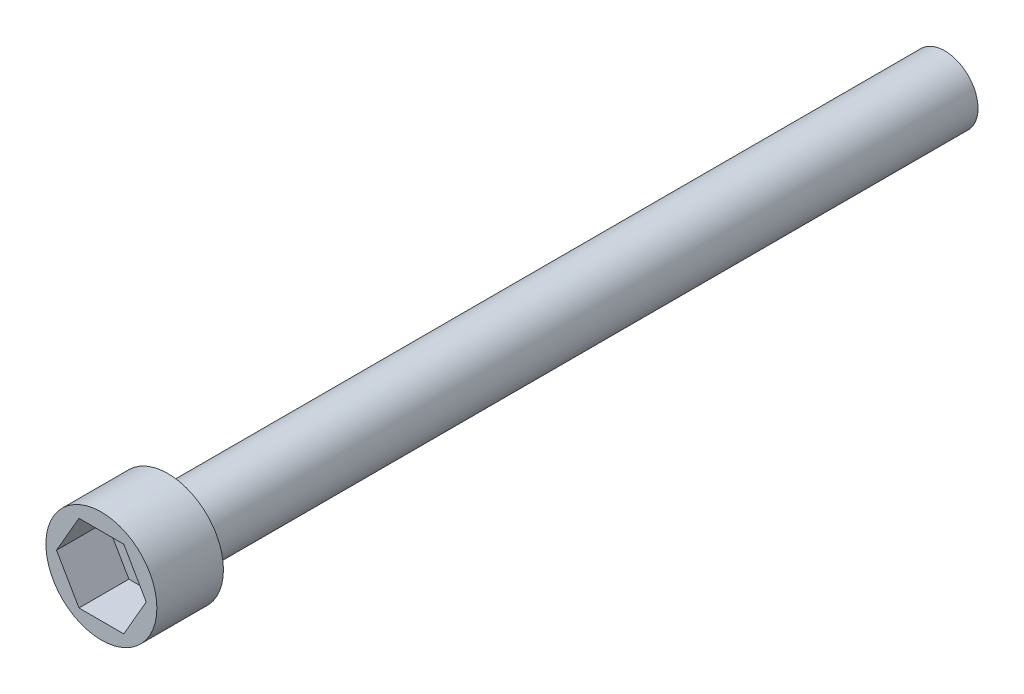
ISO-10303-21;
HEADER;
FILE_DESCRIPTION(('STEP AP214'),'2;1');
FILE_NAME('part.step','',(''),(''),'','','');
FILE_SCHEMA(('AUTOMOTIVE_DESIGN { 1 0 10303 214 1 1 1 1 }'));
ENDSEC;
DATA;
#1=APPLICATION_CONTEXT('core data for automotive mechanical design processes');
#2=APPLICATION_PROTOCOL_DEFINITION('international standard','automotive_design',2000,#1);
#3=PRODUCT_CONTEXT('',#1,'mechanical');
#4=PRODUCT('Part','Part','',(#3));
#5=PRODUCT_RELATED_PRODUCT_CATEGORY('part','',(#4));
#6=PRODUCT_DEFINITION_FORMATION('','',#4);
#7=PRODUCT_DEFINITION_CONTEXT('part definition',#1,'design');
#8=PRODUCT_DEFINITION('design','',#6,#7);
#9=PRODUCT_DEFINITION_SHAPE('','',#8);
#10=(LENGTH_UNIT() NAMED_UNIT(*) SI_UNIT(.MILLI.,.METRE.));
#11=(NAMED_UNIT(*) PLANE_ANGLE_UNIT() SI_UNIT($,.RADIAN.));
#12=(NAMED_UNIT(*) SI_UNIT($,.STERADIAN.) SOLID_ANGLE_UNIT());
#13=UNCERTAINTY_MEASURE_WITH_UNIT(LENGTH_MEASURE(1.E-05),#10,'distance_accuracy_value','');
#14=(GEOMETRIC_REPRESENTATION_CONTEXT(3) GLOBAL_UNCERTAINTY_ASSIGNED_CONTEXT((#13)) GLOBAL_UNIT_ASSIGNED_CONTEXT((#10,
#11,#12)) REPRESENTATION_CONTEXT('',''));
#15=CARTESIAN_POINT('',(0.,0.,0.));
#16=DIRECTION('',(0.,0.,1.));
#17=DIRECTION('',(1.,0.,0.));
#18=AXIS2_PLACEMENT_3D('',#15,#16,#17);
#19=CARTESIAN_POINT('',(0.,0.,70.));
#20=DIRECTION('',(0.,0.,-1.));
#21=DIRECTION('',(-1.,0.,0.));
#22=AXIS2_PLACEMENT_3D('',#19,#20,#21);
#23=CYLINDRICAL_SURFACE('',#22,3.);
#24=CARTESIAN_POINT('',(0.,0.,70.));
#25=DIRECTION('',(0.,0.,1.));
#26=DIRECTION('',(1.,0.,0.));
#27=AXIS2_PLACEMENT_3D('',#24,#25,#26);
#28=CIRCLE('',#27,3.);
#29=CARTESIAN_POINT('',(3.,0.,70.));
#30=VERTEX_POINT('',#29);
#31=EDGE_CURVE('E11',#30,#30,#28,.T.);
#32=ORIENTED_EDGE('',*,*,#31,.F.);
#33=EDGE_LOOP('',(#32));
#34=FACE_BOUND('',#33,.T.);
#35=CARTESIAN_POINT('',(0.,0.,0.));
#36=DIRECTION('',(0.,0.,1.));
#37=DIRECTION('',(1.,0.,0.));
#38=AXIS2_PLACEMENT_3D('',#35,#36,#37);
#39=CIRCLE('',#38,3.);
#40=CARTESIAN_POINT('',(3.,0.,0.));
#41=VERTEX_POINT('',#40);
#42=EDGE_CURVE('E44',#41,#41,#39,.T.);
#43=ORIENTED_EDGE('',*,*,#42,.T.);
#44=EDGE_LOOP('',(#43));
#45=FACE_BOUND('',#44,.T.);
#46=ADVANCED_FACE('F41',(#34,#45),#23,.T.);
#47=CARTESIAN_POINT('',(0.,0.,0.));
#48=DIRECTION('',(0.,0.,1.));
#49=DIRECTION('',(1.,0.,0.));
#50=AXIS2_PLACEMENT_3D('',#47,#48,#49);
#51=PLANE('',#50);
#52=ORIENTED_EDGE('',*,*,#42,.F.);
#53=EDGE_LOOP('',(#52));
#54=FACE_BOUND('',#53,.T.);
#55=ADVANCED_FACE('F191',(#54),#51,.F.);
#56=CARTESIAN_POINT('',(0.,0.,76.));
#57=DIRECTION('',(0.,0.,-1.));
#58=DIRECTION('',(-1.,0.,0.));
#59=AXIS2_PLACEMENT_3D('',#56,#57,#58);
#60=CYLINDRICAL_SURFACE('',#59,5.);
#61=CARTESIAN_POINT('',(0.,0.,76.));
#62=DIRECTION('',(0.,0.,1.));
#63=DIRECTION('',(1.,0.,0.));
#64=AXIS2_PLACEMENT_3D('',#61,#62,#63);
#65=CIRCLE('',#64,5.);
#66=CARTESIAN_POINT('',(5.,0.,76.));
#67=VERTEX_POINT('',#66);
#68=EDGE_CURVE('E165',#67,#67,#65,.T.);
#69=ORIENTED_EDGE('',*,*,#68,.F.);
#70=EDGE_LOOP('',(#69));
#71=FACE_BOUND('',#70,.T.);
#72=CARTESIAN_POINT('',(0.,0.,70.));
#73=DIRECTION('',(0.,0.,1.));
#74=DIRECTION('',(1.,0.,0.));
#75=AXIS2_PLACEMENT_3D('',#72,#73,#74);
#76=CIRCLE('',#75,5.);
#77=CARTESIAN_POINT('',(5.,0.,70.));
#78=VERTEX_POINT('',#77);
#79=EDGE_CURVE('E155',#78,#78,#76,.T.);
#80=ORIENTED_EDGE('',*,*,#79,.T.);
#81=EDGE_LOOP('',(#80));
#82=FACE_BOUND('',#81,.T.);
#83=ADVANCED_FACE('F173',(#71,#82),#60,.T.);
#84=CARTESIAN_POINT('',(0.,0.,76.));
#85=DIRECTION('',(0.,0.,1.));
#86=DIRECTION('',(1.,0.,0.));
#87=AXIS2_PLACEMENT_3D('',#84,#85,#86);
#88=PLANE('',#87);
#89=DIRECTION('',(0.5,0.866025403784439,0.));
#90=VECTOR('',#89,1.);
#91=CARTESIAN_POINT('',(2.02072594216369,-3.5,76.));
#92=LINE('',#91,#90);
#93=CARTESIAN_POINT('',(2.02072594216369,-3.5,76.));
#94=VERTEX_POINT('',#93);
#95=CARTESIAN_POINT('',(4.04145188432738,0.,76.));
#96=VERTEX_POINT('',#95);
#97=EDGE_CURVE('E56',#94,#96,#92,.T.);
#98=ORIENTED_EDGE('',*,*,#97,.F.);
#99=DIRECTION('',(1.,0.,0.));
#100=VECTOR('',#99,1.);
#101=CARTESIAN_POINT('',(-2.02072594216369,-3.5,76.));
#102=LINE('',#101,#100);
#103=CARTESIAN_POINT('',(-2.02072594216369,-3.5,76.));
#104=VERTEX_POINT('',#103);
#105=EDGE_CURVE('E149',#104,#94,#102,.T.);
#106=ORIENTED_EDGE('',*,*,#105,.F.);
#107=DIRECTION('',(0.5,-0.866025403784439,0.));
#108=VECTOR('',#107,1.);
#109=CARTESIAN_POINT('',(-4.04145188432738,0.,76.));
#110=LINE('',#109,#108);
#111=CARTESIAN_POINT('',(-4.04145188432738,0.,76.));
#112=VERTEX_POINT('',#111);
#113=EDGE_CURVE('E146',#112,#104,#110,.T.);
#114=ORIENTED_EDGE('',*,*,#113,.F.);
#115=DIRECTION('',(-0.5,-0.866025403784439,0.));
#116=VECTOR('',#115,1.);
#117=CARTESIAN_POINT('',(-2.02072594216369,3.5,76.));
#118=LINE('',#117,#116);
#119=CARTESIAN_POINT('',(-2.02072594216369,3.5,76.));
#120=VERTEX_POINT('',#119);
#121=EDGE_CURVE('E104',#120,#112,#118,.T.);
#122=ORIENTED_EDGE('',*,*,#121,.F.);
#123=DIRECTION('',(-1.,0.,0.));
#124=VECTOR('',#123,1.);
#125=CARTESIAN_POINT('',(2.02072594216369,3.5,76.));
#126=LINE('',#125,#124);
#127=CARTESIAN_POINT('',(2.02072594216369,3.5,76.));
#128=VERTEX_POINT('',#127);
#129=EDGE_CURVE('E140',#128,#120,#126,.T.);
#130=ORIENTED_EDGE('',*,*,#129,.F.);
#131=DIRECTION('',(-0.5,0.866025403784439,0.));
#132=VECTOR('',#131,1.);
#133=CARTESIAN_POINT('',(4.04145188432738,0.,76.));
#134=LINE('',#133,#132);
#135=EDGE_CURVE('E136',#96,#128,#134,.T.);
#136=ORIENTED_EDGE('',*,*,#135,.F.);
#137=EDGE_LOOP('',(#98,#106,#114,#122,#130,#136));
#138=FACE_BOUND('',#137,.T.);
#139=ORIENTED_EDGE('',*,*,#68,.T.);
#140=EDGE_LOOP('',(#139));
#141=FACE_BOUND('',#140,.T.);
#142=ADVANCED_FACE('F178',(#138,#141),#88,.T.);
#143=CARTESIAN_POINT('',(0.,0.,70.));
#144=DIRECTION('',(0.,0.,1.));
#145=DIRECTION('',(1.,0.,0.));
#146=AXIS2_PLACEMENT_3D('',#143,#144,#145);
#147=PLANE('',#146);
#148=ORIENTED_EDGE('',*,*,#31,.T.);
#149=EDGE_LOOP('',(#148));
#150=FACE_BOUND('',#149,.T.);
#151=ORIENTED_EDGE('',*,*,#79,.F.);
#152=EDGE_LOOP('',(#151));
#153=FACE_BOUND('',#152,.T.);
#154=ADVANCED_FACE('F175',(#150,#153),#147,.F.);
#155=CARTESIAN_POINT('',(2.02072594216369,-3.5,71.5));
#156=DIRECTION('',(0.866025403784439,-0.5,0.));
#157=DIRECTION('',(0.5,0.866025403784439,0.));
#158=AXIS2_PLACEMENT_3D('',#155,#156,#157);
#159=PLANE('',#158);
#160=ORIENTED_EDGE('',*,*,#97,.T.);
#161=DIRECTION('',(0.,0.,1.));
#162=VECTOR('',#161,1.);
#163=CARTESIAN_POINT('',(4.04145188432738,0.,71.5));
#164=LINE('',#163,#162);
#165=CARTESIAN_POINT('',(4.04145188432738,0.,71.5));
#166=VERTEX_POINT('',#165);
#167=EDGE_CURVE('E86',#166,#96,#164,.T.);
#168=ORIENTED_EDGE('',*,*,#167,.F.);
#169=DIRECTION('',(0.5,0.866025403784439,0.));
#170=VECTOR('',#169,1.);
#171=CARTESIAN_POINT('',(2.02072594216369,-3.5,71.5));
#172=LINE('',#171,#170);
#173=CARTESIAN_POINT('',(2.02072594216369,-3.5,71.5));
#174=VERTEX_POINT('',#173);
#175=EDGE_CURVE('E152',#174,#166,#172,.T.);
#176=ORIENTED_EDGE('',*,*,#175,.F.);
#177=DIRECTION('',(0.,0.,1.));
#178=VECTOR('',#177,1.);
#179=CARTESIAN_POINT('',(2.02072594216369,-3.5,71.5));
#180=LINE('',#179,#178);
#181=EDGE_CURVE('E64',#174,#94,#180,.T.);
#182=ORIENTED_EDGE('',*,*,#181,.T.);
#183=EDGE_LOOP('',(#160,#168,#176,#182));
#184=FACE_BOUND('',#183,.T.);
#185=ADVANCED_FACE('F177',(#184),#159,.F.);
#186=CARTESIAN_POINT('',(-2.02072594216369,-3.5,71.5));
#187=DIRECTION('',(0.,-1.,0.));
#188=DIRECTION('',(1.,0.,0.));
#189=AXIS2_PLACEMENT_3D('',#186,#187,#188);
#190=PLANE('',#189);
#191=ORIENTED_EDGE('',*,*,#105,.T.);
#192=ORIENTED_EDGE('',*,*,#181,.F.);
#193=DIRECTION('',(1.,0.,0.));
#194=VECTOR('',#193,1.);
#195=CARTESIAN_POINT('',(-2.02072594216369,-3.5,71.5));
#196=LINE('',#195,#194);
#197=CARTESIAN_POINT('',(-2.02072594216369,-3.5,71.5));
#198=VERTEX_POINT('',#197);
#199=EDGE_CURVE('E118',#198,#174,#196,.T.);
#200=ORIENTED_EDGE('',*,*,#199,.F.);
#201=DIRECTION('',(0.,0.,1.));
#202=VECTOR('',#201,1.);
#203=CARTESIAN_POINT('',(-2.02072594216369,-3.5,71.5));
#204=LINE('',#203,#202);
#205=EDGE_CURVE('E109',#198,#104,#204,.T.);
#206=ORIENTED_EDGE('',*,*,#205,.T.);
#207=EDGE_LOOP('',(#191,#192,#200,#206));
#208=FACE_BOUND('',#207,.T.);
#209=ADVANCED_FACE('F185',(#208),#190,.F.);
#210=CARTESIAN_POINT('',(-4.04145188432738,0.,71.5));
#211=DIRECTION('',(-0.866025403784439,-0.5,0.));
#212=DIRECTION('',(0.5,-0.866025403784439,0.));
#213=AXIS2_PLACEMENT_3D('',#210,#211,#212);
#214=PLANE('',#213);
#215=ORIENTED_EDGE('',*,*,#113,.T.);
#216=ORIENTED_EDGE('',*,*,#205,.F.);
#217=DIRECTION('',(0.5,-0.866025403784439,0.));
#218=VECTOR('',#217,1.);
#219=CARTESIAN_POINT('',(-4.04145188432738,0.,71.5));
#220=LINE('',#219,#218);
#221=CARTESIAN_POINT('',(-4.04145188432738,0.,71.5));
#222=VERTEX_POINT('',#221);
#223=EDGE_CURVE('E113',#222,#198,#220,.T.);
#224=ORIENTED_EDGE('',*,*,#223,.F.);
#225=DIRECTION('',(0.,0.,1.));
#226=VECTOR('',#225,1.);
#227=CARTESIAN_POINT('',(-4.04145188432738,0.,71.5));
#228=LINE('',#227,#226);
#229=EDGE_CURVE('E97',#222,#112,#228,.T.);
#230=ORIENTED_EDGE('',*,*,#229,.T.);
#231=EDGE_LOOP('',(#215,#216,#224,#230));
#232=FACE_BOUND('',#231,.T.);
#233=ADVANCED_FACE('F114',(#232),#214,.F.);
#234=CARTESIAN_POINT('',(-2.02072594216369,3.5,71.5));
#235=DIRECTION('',(-0.866025403784439,0.5,0.));
#236=DIRECTION('',(-0.5,-0.866025403784439,0.));
#237=AXIS2_PLACEMENT_3D('',#234,#235,#236);
#238=PLANE('',#237);
#239=ORIENTED_EDGE('',*,*,#121,.T.);
#240=ORIENTED_EDGE('',*,*,#229,.F.);
#241=DIRECTION('',(-0.5,-0.866025403784439,0.));
#242=VECTOR('',#241,1.);
#243=CARTESIAN_POINT('',(-2.02072594216369,3.5,71.5));
#244=LINE('',#243,#242);
#245=CARTESIAN_POINT('',(-2.02072594216369,3.5,71.5));
#246=VERTEX_POINT('',#245);
#247=EDGE_CURVE('E101',#246,#222,#244,.T.);
#248=ORIENTED_EDGE('',*,*,#247,.F.);
#249=DIRECTION('',(0.,0.,1.));
#250=VECTOR('',#249,1.);
#251=CARTESIAN_POINT('',(-2.02072594216369,3.5,71.5));
#252=LINE('',#251,#250);
#253=EDGE_CURVE('E110',#246,#120,#252,.T.);
#254=ORIENTED_EDGE('',*,*,#253,.T.);
#255=EDGE_LOOP('',(#239,#240,#248,#254));
#256=FACE_BOUND('',#255,.T.);
#257=ADVANCED_FACE('F99',(#256),#238,.F.);
#258=CARTESIAN_POINT('',(2.02072594216369,3.5,71.5));
#259=DIRECTION('',(0.,1.,0.));
#260=DIRECTION('',(-1.,0.,0.));
#261=AXIS2_PLACEMENT_3D('',#258,#259,#260);
#262=PLANE('',#261);
#263=ORIENTED_EDGE('',*,*,#129,.T.);
#264=ORIENTED_EDGE('',*,*,#253,.F.);
#265=DIRECTION('',(-1.,0.,0.));
#266=VECTOR('',#265,1.);
#267=CARTESIAN_POINT('',(2.02072594216369,3.5,71.5));
#268=LINE('',#267,#266);
#269=CARTESIAN_POINT('',(2.02072594216369,3.5,71.5));
#270=VERTEX_POINT('',#269);
#271=EDGE_CURVE('E124',#270,#246,#268,.T.);
#272=ORIENTED_EDGE('',*,*,#271,.F.);
#273=DIRECTION('',(0.,0.,1.));
#274=VECTOR('',#273,1.);
#275=CARTESIAN_POINT('',(2.02072594216369,3.5,71.5));
#276=LINE('',#275,#274);
#277=EDGE_CURVE('E160',#270,#128,#276,.T.);
#278=ORIENTED_EDGE('',*,*,#277,.T.);
#279=EDGE_LOOP('',(#263,#264,#272,#278));
#280=FACE_BOUND('',#279,.T.);
#281=ADVANCED_FACE('F247',(#280),#262,.F.);
#282=CARTESIAN_POINT('',(4.04145188432738,0.,71.5));
#283=DIRECTION('',(0.866025403784439,0.5,0.));
#284=DIRECTION('',(-0.5,0.866025403784439,0.));
#285=AXIS2_PLACEMENT_3D('',#282,#283,#284);
#286=PLANE('',#285);
#287=ORIENTED_EDGE('',*,*,#135,.T.);
#288=ORIENTED_EDGE('',*,*,#277,.F.);
#289=DIRECTION('',(-0.5,0.866025403784439,0.));
#290=VECTOR('',#289,1.);
#291=CARTESIAN_POINT('',(4.04145188432738,0.,71.5));
#292=LINE('',#291,#290);
#293=EDGE_CURVE('E128',#166,#270,#292,.T.);
#294=ORIENTED_EDGE('',*,*,#293,.F.);
#295=ORIENTED_EDGE('',*,*,#167,.T.);
#296=EDGE_LOOP('',(#287,#288,#294,#295));
#297=FACE_BOUND('',#296,.T.);
#298=ADVANCED_FACE('F256',(#297),#286,.F.);
#299=CARTESIAN_POINT('',(0.,0.,71.5));
#300=DIRECTION('',(0.,0.,1.));
#301=DIRECTION('',(1.,0.,0.));
#302=AXIS2_PLACEMENT_3D('',#299,#300,#301);
#303=PLANE('',#302);
#304=ORIENTED_EDGE('',*,*,#175,.T.);
#305=ORIENTED_EDGE('',*,*,#293,.T.);
#306=ORIENTED_EDGE('',*,*,#271,.T.);
#307=ORIENTED_EDGE('',*,*,#247,.T.);
#308=ORIENTED_EDGE('',*,*,#223,.T.);
#309=ORIENTED_EDGE('',*,*,#199,.T.);
#310=EDGE_LOOP('',(#304,#305,#306,#307,#308,#309));
#311=FACE_BOUND('',#310,.T.);
#312=ADVANCED_FACE('F121',(#311),#303,.T.);
#313=CLOSED_SHELL('',(#46,#55,#83,#142,#154,#185,#209,#233,#257,#281,#298,#312));
#314=MANIFOLD_SOLID_BREP('B2',#313);
#315=ADVANCED_BREP_SHAPE_REPRESENTATION('',(#18,#314),#14);
#316=SHAPE_DEFINITION_REPRESENTATION(#9,#315);
ENDSEC;
END-ISO-10303-21;
